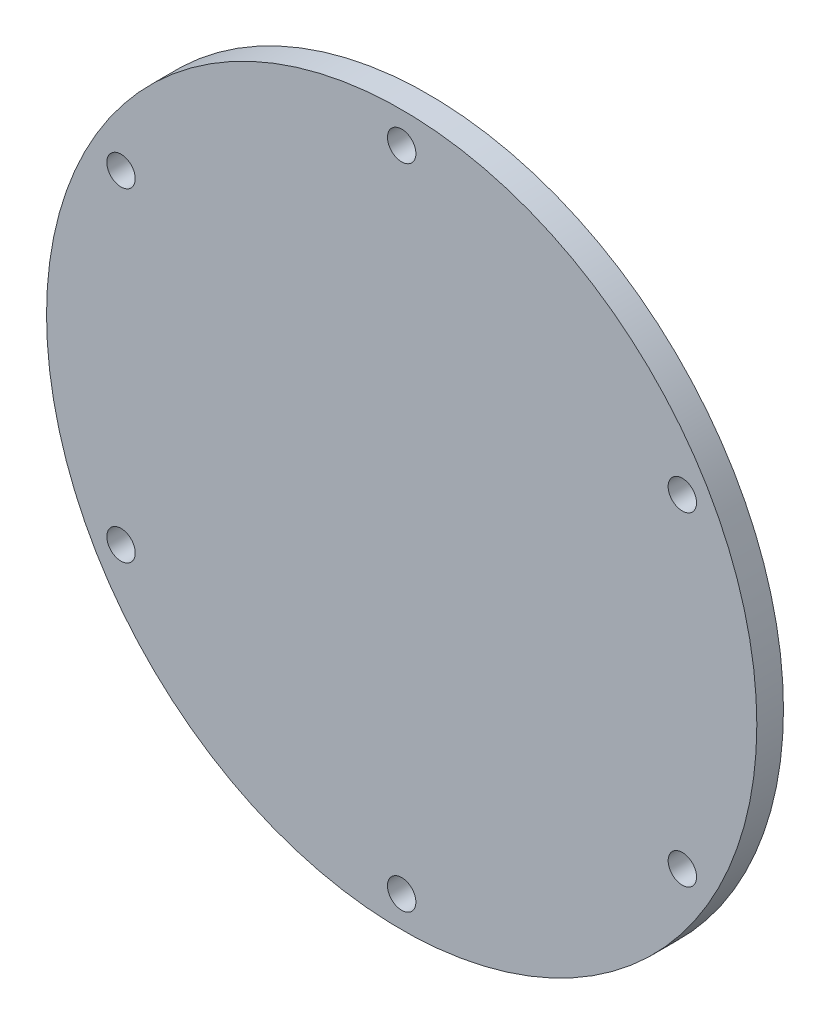
ISO-10303-21;
HEADER;
FILE_DESCRIPTION(('STEP AP214'),'2;1');
FILE_NAME('part.step','',(''),(''),'','','');
FILE_SCHEMA(('AUTOMOTIVE_DESIGN { 1 0 10303 214 1 1 1 1 }'));
ENDSEC;
DATA;
#1=APPLICATION_CONTEXT('core data for automotive mechanical design processes');
#2=APPLICATION_PROTOCOL_DEFINITION('international standard','automotive_design',2000,#1);
#3=PRODUCT_CONTEXT('',#1,'mechanical');
#4=PRODUCT('Part','Part','',(#3));
#5=PRODUCT_RELATED_PRODUCT_CATEGORY('part','',(#4));
#6=PRODUCT_DEFINITION_FORMATION('','',#4);
#7=PRODUCT_DEFINITION_CONTEXT('part definition',#1,'design');
#8=PRODUCT_DEFINITION('design','',#6,#7);
#9=PRODUCT_DEFINITION_SHAPE('','',#8);
#10=(LENGTH_UNIT() NAMED_UNIT(*) SI_UNIT(.MILLI.,.METRE.));
#11=(NAMED_UNIT(*) PLANE_ANGLE_UNIT() SI_UNIT($,.RADIAN.));
#12=(NAMED_UNIT(*) SI_UNIT($,.STERADIAN.) SOLID_ANGLE_UNIT());
#13=UNCERTAINTY_MEASURE_WITH_UNIT(LENGTH_MEASURE(1.E-05),#10,'distance_accuracy_value','');
#14=(GEOMETRIC_REPRESENTATION_CONTEXT(3) GLOBAL_UNCERTAINTY_ASSIGNED_CONTEXT((#13)) GLOBAL_UNIT_ASSIGNED_CONTEXT((#10,
#11,#12)) REPRESENTATION_CONTEXT('',''));
#15=CARTESIAN_POINT('',(0.,0.,0.));
#16=DIRECTION('',(0.,0.,1.));
#17=DIRECTION('',(1.,0.,0.));
#18=AXIS2_PLACEMENT_3D('',#15,#16,#17);
#19=CARTESIAN_POINT('',(0.,0.,3.));
#20=DIRECTION('',(0.,0.,1.));
#21=DIRECTION('',(1.,0.,0.));
#22=AXIS2_PLACEMENT_3D('',#19,#20,#21);
#23=PLANE('',#22);
#24=CARTESIAN_POINT('',(-31.609927238132,-18.25,3.));
#25=DIRECTION('',(0.,0.,1.));
#26=DIRECTION('',(1.,0.,0.));
#27=AXIS2_PLACEMENT_3D('',#24,#25,#26);
#28=CIRCLE('',#27,1.6);
#29=CARTESIAN_POINT('',(-30.009927238132,-18.25,3.));
#30=VERTEX_POINT('',#29);
#31=EDGE_CURVE('E65',#30,#30,#28,.T.);
#32=ORIENTED_EDGE('',*,*,#31,.F.);
#33=EDGE_LOOP('',(#32));
#34=FACE_BOUND('',#33,.T.);
#35=CARTESIAN_POINT('',(0.,36.5,3.));
#36=DIRECTION('',(0.,0.,1.));
#37=DIRECTION('',(1.,0.,0.));
#38=AXIS2_PLACEMENT_3D('',#35,#36,#37);
#39=CIRCLE('',#38,1.6);
#40=CARTESIAN_POINT('',(1.6,36.5,3.));
#41=VERTEX_POINT('',#40);
#42=EDGE_CURVE('E53',#41,#41,#39,.T.);
#43=ORIENTED_EDGE('',*,*,#42,.F.);
#44=EDGE_LOOP('',(#43));
#45=FACE_BOUND('',#44,.T.);
#46=CARTESIAN_POINT('',(31.609927238132,-18.25,3.));
#47=DIRECTION('',(0.,0.,1.));
#48=DIRECTION('',(1.,0.,0.));
#49=AXIS2_PLACEMENT_3D('',#46,#47,#48);
#50=CIRCLE('',#49,1.6);
#51=CARTESIAN_POINT('',(33.209927238132,-18.25,3.));
#52=VERTEX_POINT('',#51);
#53=EDGE_CURVE('E42',#52,#52,#50,.T.);
#54=ORIENTED_EDGE('',*,*,#53,.F.);
#55=EDGE_LOOP('',(#54));
#56=FACE_BOUND('',#55,.T.);
#57=CARTESIAN_POINT('',(0.,0.,3.));
#58=DIRECTION('',(0.,0.,1.));
#59=DIRECTION('',(1.,0.,0.));
#60=AXIS2_PLACEMENT_3D('',#57,#58,#59);
#61=CIRCLE('',#60,40.);
#62=CARTESIAN_POINT('',(40.,0.,3.));
#63=VERTEX_POINT('',#62);
#64=EDGE_CURVE('E10',#63,#63,#61,.T.);
#65=ORIENTED_EDGE('',*,*,#64,.T.);
#66=EDGE_LOOP('',(#65));
#67=FACE_BOUND('',#66,.T.);
#68=CARTESIAN_POINT('',(31.609927238132,18.25,3.));
#69=DIRECTION('',(0.,0.,1.));
#70=DIRECTION('',(1.,0.,0.));
#71=AXIS2_PLACEMENT_3D('',#68,#69,#70);
#72=CIRCLE('',#71,1.6);
#73=CARTESIAN_POINT('',(33.209927238132,18.25,3.));
#74=VERTEX_POINT('',#73);
#75=EDGE_CURVE('E47',#74,#74,#72,.T.);
#76=ORIENTED_EDGE('',*,*,#75,.F.);
#77=EDGE_LOOP('',(#76));
#78=FACE_BOUND('',#77,.T.);
#79=CARTESIAN_POINT('',(-31.609927238132,18.25,3.));
#80=DIRECTION('',(0.,0.,1.));
#81=DIRECTION('',(1.,0.,0.));
#82=AXIS2_PLACEMENT_3D('',#79,#80,#81);
#83=CIRCLE('',#82,1.6);
#84=CARTESIAN_POINT('',(-30.009927238132,18.25,3.));
#85=VERTEX_POINT('',#84);
#86=EDGE_CURVE('E59',#85,#85,#83,.T.);
#87=ORIENTED_EDGE('',*,*,#86,.F.);
#88=EDGE_LOOP('',(#87));
#89=FACE_BOUND('',#88,.T.);
#90=CARTESIAN_POINT('',(0.,-36.5,3.));
#91=DIRECTION('',(0.,0.,1.));
#92=DIRECTION('',(1.,0.,0.));
#93=AXIS2_PLACEMENT_3D('',#90,#91,#92);
#94=CIRCLE('',#93,1.6);
#95=CARTESIAN_POINT('',(1.6,-36.5,3.));
#96=VERTEX_POINT('',#95);
#97=EDGE_CURVE('E71',#96,#96,#94,.T.);
#98=ORIENTED_EDGE('',*,*,#97,.F.);
#99=EDGE_LOOP('',(#98));
#100=FACE_BOUND('',#99,.T.);
#101=ADVANCED_FACE('F31',(#34,#45,#56,#67,#78,#89,#100),#23,.T.);
#102=CARTESIAN_POINT('',(0.,0.,0.));
#103=DIRECTION('',(0.,0.,1.));
#104=DIRECTION('',(1.,0.,0.));
#105=AXIS2_PLACEMENT_3D('',#102,#103,#104);
#106=PLANE('',#105);
#107=CARTESIAN_POINT('',(0.,0.,0.));
#108=DIRECTION('',(0.,0.,1.));
#109=DIRECTION('',(1.,0.,0.));
#110=AXIS2_PLACEMENT_3D('',#107,#108,#109);
#111=CIRCLE('',#110,40.);
#112=CARTESIAN_POINT('',(40.,0.,0.));
#113=VERTEX_POINT('',#112);
#114=EDGE_CURVE('E35',#113,#113,#111,.T.);
#115=ORIENTED_EDGE('',*,*,#114,.F.);
#116=EDGE_LOOP('',(#115));
#117=FACE_BOUND('',#116,.T.);
#118=CARTESIAN_POINT('',(31.609927238132,-18.25,0.));
#119=DIRECTION('',(0.,0.,1.));
#120=DIRECTION('',(1.,0.,0.));
#121=AXIS2_PLACEMENT_3D('',#118,#119,#120);
#122=CIRCLE('',#121,1.6);
#123=CARTESIAN_POINT('',(33.209927238132,-18.25,0.));
#124=VERTEX_POINT('',#123);
#125=EDGE_CURVE('E44',#124,#124,#122,.T.);
#126=ORIENTED_EDGE('',*,*,#125,.T.);
#127=EDGE_LOOP('',(#126));
#128=FACE_BOUND('',#127,.T.);
#129=CARTESIAN_POINT('',(31.609927238132,18.25,0.));
#130=DIRECTION('',(0.,0.,1.));
#131=DIRECTION('',(1.,0.,0.));
#132=AXIS2_PLACEMENT_3D('',#129,#130,#131);
#133=CIRCLE('',#132,1.6);
#134=CARTESIAN_POINT('',(33.209927238132,18.25,0.));
#135=VERTEX_POINT('',#134);
#136=EDGE_CURVE('E50',#135,#135,#133,.T.);
#137=ORIENTED_EDGE('',*,*,#136,.T.);
#138=EDGE_LOOP('',(#137));
#139=FACE_BOUND('',#138,.T.);
#140=CARTESIAN_POINT('',(0.,36.5,0.));
#141=DIRECTION('',(0.,0.,1.));
#142=DIRECTION('',(1.,0.,0.));
#143=AXIS2_PLACEMENT_3D('',#140,#141,#142);
#144=CIRCLE('',#143,1.6);
#145=CARTESIAN_POINT('',(1.6,36.5,0.));
#146=VERTEX_POINT('',#145);
#147=EDGE_CURVE('E56',#146,#146,#144,.T.);
#148=ORIENTED_EDGE('',*,*,#147,.T.);
#149=EDGE_LOOP('',(#148));
#150=FACE_BOUND('',#149,.T.);
#151=CARTESIAN_POINT('',(-31.609927238132,18.25,0.));
#152=DIRECTION('',(0.,0.,1.));
#153=DIRECTION('',(1.,0.,0.));
#154=AXIS2_PLACEMENT_3D('',#151,#152,#153);
#155=CIRCLE('',#154,1.6);
#156=CARTESIAN_POINT('',(-30.009927238132,18.25,0.));
#157=VERTEX_POINT('',#156);
#158=EDGE_CURVE('E62',#157,#157,#155,.T.);
#159=ORIENTED_EDGE('',*,*,#158,.T.);
#160=EDGE_LOOP('',(#159));
#161=FACE_BOUND('',#160,.T.);
#162=CARTESIAN_POINT('',(-31.609927238132,-18.25,0.));
#163=DIRECTION('',(0.,0.,1.));
#164=DIRECTION('',(1.,0.,0.));
#165=AXIS2_PLACEMENT_3D('',#162,#163,#164);
#166=CIRCLE('',#165,1.6);
#167=CARTESIAN_POINT('',(-30.009927238132,-18.25,0.));
#168=VERTEX_POINT('',#167);
#169=EDGE_CURVE('E68',#168,#168,#166,.T.);
#170=ORIENTED_EDGE('',*,*,#169,.T.);
#171=EDGE_LOOP('',(#170));
#172=FACE_BOUND('',#171,.T.);
#173=CARTESIAN_POINT('',(0.,-36.5,0.));
#174=DIRECTION('',(0.,0.,1.));
#175=DIRECTION('',(1.,0.,0.));
#176=AXIS2_PLACEMENT_3D('',#173,#174,#175);
#177=CIRCLE('',#176,1.6);
#178=CARTESIAN_POINT('',(1.6,-36.5,0.));
#179=VERTEX_POINT('',#178);
#180=EDGE_CURVE('E74',#179,#179,#177,.T.);
#181=ORIENTED_EDGE('',*,*,#180,.T.);
#182=EDGE_LOOP('',(#181));
#183=FACE_BOUND('',#182,.T.);
#184=ADVANCED_FACE('F84',(#117,#128,#139,#150,#161,#172,#183),#106,.F.);
#185=CARTESIAN_POINT('',(0.,0.,3.));
#186=DIRECTION('',(0.,0.,-1.));
#187=DIRECTION('',(-1.,0.,0.));
#188=AXIS2_PLACEMENT_3D('',#185,#186,#187);
#189=CYLINDRICAL_SURFACE('',#188,40.);
#190=ORIENTED_EDGE('',*,*,#64,.F.);
#191=EDGE_LOOP('',(#190));
#192=FACE_BOUND('',#191,.T.);
#193=ORIENTED_EDGE('',*,*,#114,.T.);
#194=EDGE_LOOP('',(#193));
#195=FACE_BOUND('',#194,.T.);
#196=ADVANCED_FACE('F33',(#192,#195),#189,.T.);
#197=CARTESIAN_POINT('',(31.609927238132,-18.25,3.));
#198=DIRECTION('',(0.,0.,-1.));
#199=DIRECTION('',(-1.,0.,0.));
#200=AXIS2_PLACEMENT_3D('',#197,#198,#199);
#201=CYLINDRICAL_SURFACE('',#200,1.6);
#202=ORIENTED_EDGE('',*,*,#53,.T.);
#203=EDGE_LOOP('',(#202));
#204=FACE_BOUND('',#203,.T.);
#205=ORIENTED_EDGE('',*,*,#125,.F.);
#206=EDGE_LOOP('',(#205));
#207=FACE_BOUND('',#206,.T.);
#208=ADVANCED_FACE('F94',(#204,#207),#201,.F.);
#209=CARTESIAN_POINT('',(31.609927238132,18.25,3.));
#210=DIRECTION('',(0.,0.,-1.));
#211=DIRECTION('',(-1.,0.,0.));
#212=AXIS2_PLACEMENT_3D('',#209,#210,#211);
#213=CYLINDRICAL_SURFACE('',#212,1.6);
#214=ORIENTED_EDGE('',*,*,#75,.T.);
#215=EDGE_LOOP('',(#214));
#216=FACE_BOUND('',#215,.T.);
#217=ORIENTED_EDGE('',*,*,#136,.F.);
#218=EDGE_LOOP('',(#217));
#219=FACE_BOUND('',#218,.T.);
#220=ADVANCED_FACE('F97',(#216,#219),#213,.F.);
#221=CARTESIAN_POINT('',(0.,36.5,3.));
#222=DIRECTION('',(0.,0.,-1.));
#223=DIRECTION('',(-1.,0.,0.));
#224=AXIS2_PLACEMENT_3D('',#221,#222,#223);
#225=CYLINDRICAL_SURFACE('',#224,1.6);
#226=ORIENTED_EDGE('',*,*,#42,.T.);
#227=EDGE_LOOP('',(#226));
#228=FACE_BOUND('',#227,.T.);
#229=ORIENTED_EDGE('',*,*,#147,.F.);
#230=EDGE_LOOP('',(#229));
#231=FACE_BOUND('',#230,.T.);
#232=ADVANCED_FACE('F101',(#228,#231),#225,.F.);
#233=CARTESIAN_POINT('',(-31.609927238132,18.25,3.));
#234=DIRECTION('',(0.,0.,-1.));
#235=DIRECTION('',(-1.,0.,0.));
#236=AXIS2_PLACEMENT_3D('',#233,#234,#235);
#237=CYLINDRICAL_SURFACE('',#236,1.6);
#238=ORIENTED_EDGE('',*,*,#86,.T.);
#239=EDGE_LOOP('',(#238));
#240=FACE_BOUND('',#239,.T.);
#241=ORIENTED_EDGE('',*,*,#158,.F.);
#242=EDGE_LOOP('',(#241));
#243=FACE_BOUND('',#242,.T.);
#244=ADVANCED_FACE('F105',(#240,#243),#237,.F.);
#245=CARTESIAN_POINT('',(-31.609927238132,-18.25,3.));
#246=DIRECTION('',(0.,0.,-1.));
#247=DIRECTION('',(-1.,0.,0.));
#248=AXIS2_PLACEMENT_3D('',#245,#246,#247);
#249=CYLINDRICAL_SURFACE('',#248,1.6);
#250=ORIENTED_EDGE('',*,*,#31,.T.);
#251=EDGE_LOOP('',(#250));
#252=FACE_BOUND('',#251,.T.);
#253=ORIENTED_EDGE('',*,*,#169,.F.);
#254=EDGE_LOOP('',(#253));
#255=FACE_BOUND('',#254,.T.);
#256=ADVANCED_FACE('F109',(#252,#255),#249,.F.);
#257=CARTESIAN_POINT('',(0.,-36.5,3.));
#258=DIRECTION('',(0.,0.,-1.));
#259=DIRECTION('',(-1.,0.,0.));
#260=AXIS2_PLACEMENT_3D('',#257,#258,#259);
#261=CYLINDRICAL_SURFACE('',#260,1.6);
#262=ORIENTED_EDGE('',*,*,#97,.T.);
#263=EDGE_LOOP('',(#262));
#264=FACE_BOUND('',#263,.T.);
#265=ORIENTED_EDGE('',*,*,#180,.F.);
#266=EDGE_LOOP('',(#265));
#267=FACE_BOUND('',#266,.T.);
#268=ADVANCED_FACE('F80',(#264,#267),#261,.F.);
#269=CLOSED_SHELL('',(#101,#184,#196,#208,#220,#232,#244,#256,#268));
#270=MANIFOLD_SOLID_BREP('B2',#269);
#271=ADVANCED_BREP_SHAPE_REPRESENTATION('',(#18,#270),#14);
#272=SHAPE_DEFINITION_REPRESENTATION(#9,#271);
ENDSEC;
END-ISO-10303-21;
